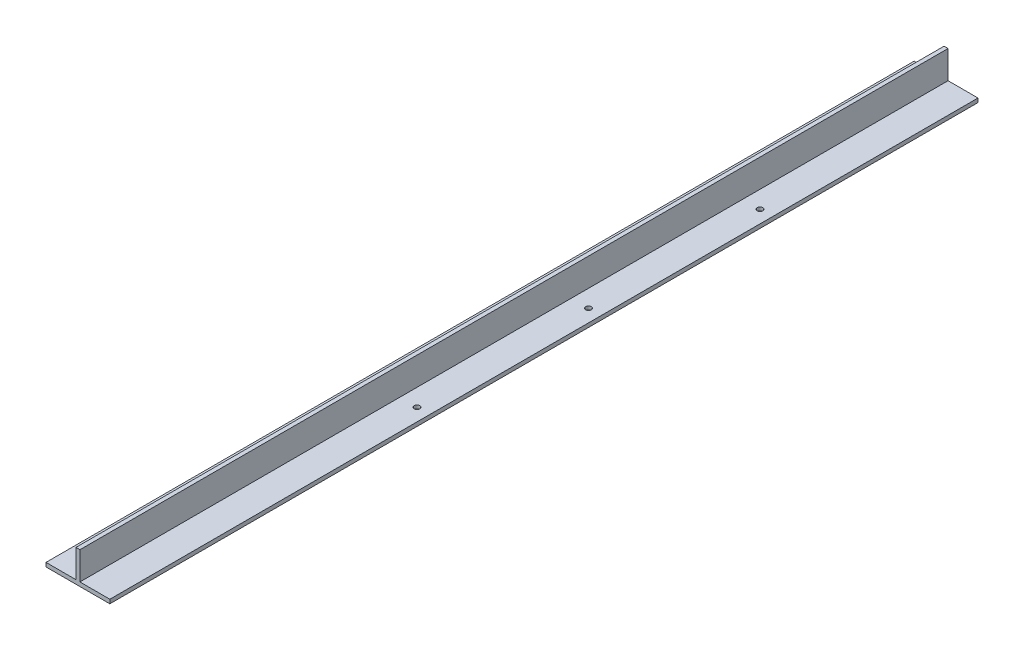
ISO-10303-21;
HEADER;
FILE_DESCRIPTION(('STEP AP214'),'2;1');
FILE_NAME('part.step','',(''),(''),'','','');
FILE_SCHEMA(('AUTOMOTIVE_DESIGN { 1 0 10303 214 1 1 1 1 }'));
ENDSEC;
DATA;
#1=APPLICATION_CONTEXT('core data for automotive mechanical design processes');
#2=APPLICATION_PROTOCOL_DEFINITION('international standard','automotive_design',2000,#1);
#3=PRODUCT_CONTEXT('',#1,'mechanical');
#4=PRODUCT('Part','Part','',(#3));
#5=PRODUCT_RELATED_PRODUCT_CATEGORY('part','',(#4));
#6=PRODUCT_DEFINITION_FORMATION('','',#4);
#7=PRODUCT_DEFINITION_CONTEXT('part definition',#1,'design');
#8=PRODUCT_DEFINITION('design','',#6,#7);
#9=PRODUCT_DEFINITION_SHAPE('','',#8);
#10=(LENGTH_UNIT() NAMED_UNIT(*) SI_UNIT(.MILLI.,.METRE.));
#11=(NAMED_UNIT(*) PLANE_ANGLE_UNIT() SI_UNIT($,.RADIAN.));
#12=(NAMED_UNIT(*) SI_UNIT($,.STERADIAN.) SOLID_ANGLE_UNIT());
#13=UNCERTAINTY_MEASURE_WITH_UNIT(LENGTH_MEASURE(1.E-05),#10,'distance_accuracy_value','');
#14=(GEOMETRIC_REPRESENTATION_CONTEXT(3) GLOBAL_UNCERTAINTY_ASSIGNED_CONTEXT((#13)) GLOBAL_UNIT_ASSIGNED_CONTEXT((#10,
#11,#12)) REPRESENTATION_CONTEXT('',''));
#15=CARTESIAN_POINT('',(0.,0.,0.));
#16=DIRECTION('',(0.,0.,1.));
#17=DIRECTION('',(1.,0.,0.));
#18=AXIS2_PLACEMENT_3D('',#15,#16,#17);
#19=CARTESIAN_POINT('',(-150.489347611488,-310.689072168843,-406.95));
#20=DIRECTION('',(0.,-1.,0.));
#21=DIRECTION('',(0.,0.,-1.));
#22=AXIS2_PLACEMENT_3D('',#19,#20,#21);
#23=CYLINDRICAL_SURFACE('',#22,3.4);
#24=CARTESIAN_POINT('',(-150.489347611488,-310.017902480922,-406.95));
#25=DIRECTION('',(0.,-1.,0.));
#26=DIRECTION('',(1.,0.,0.));
#27=AXIS2_PLACEMENT_3D('',#24,#25,#26);
#28=CIRCLE('',#27,3.39999999994731);
#29=CARTESIAN_POINT('',(-147.089347611541,-310.017902480922,-406.95));
#30=VERTEX_POINT('',#29);
#31=EDGE_CURVE('E148',#30,#30,#28,.T.);
#32=ORIENTED_EDGE('',*,*,#31,.T.);
#33=EDGE_LOOP('',(#32));
#34=FACE_BOUND('',#33,.T.);
#35=CARTESIAN_POINT('',(-150.489347611488,-305.926572168843,-406.95));
#36=DIRECTION('',(0.,-1.,0.));
#37=DIRECTION('',(0.,0.,-1.));
#38=AXIS2_PLACEMENT_3D('',#35,#36,#37);
#39=CIRCLE('',#38,3.4);
#40=CARTESIAN_POINT('',(-150.489347611488,-305.926572168843,-410.35));
#41=VERTEX_POINT('',#40);
#42=EDGE_CURVE('E20',#41,#41,#39,.T.);
#43=ORIENTED_EDGE('',*,*,#42,.F.);
#44=EDGE_LOOP('',(#43));
#45=FACE_BOUND('',#44,.T.);
#46=ADVANCED_FACE('F17',(#34,#45),#23,.F.);
#47=CARTESIAN_POINT('',(-196.489347611488,-310.689072168843,139.05));
#48=DIRECTION('',(0.,-1.,0.));
#49=DIRECTION('',(0.,0.,-1.));
#50=AXIS2_PLACEMENT_3D('',#47,#48,#49);
#51=CYLINDRICAL_SURFACE('',#50,3.4);
#52=CARTESIAN_POINT('',(-196.489347611488,-305.926572168843,139.05));
#53=DIRECTION('',(0.,-1.,0.));
#54=DIRECTION('',(0.,0.,-1.));
#55=AXIS2_PLACEMENT_3D('',#52,#53,#54);
#56=CIRCLE('',#55,3.4);
#57=CARTESIAN_POINT('',(-196.489347611488,-305.926572168843,135.65));
#58=VERTEX_POINT('',#57);
#59=EDGE_CURVE('E122',#58,#58,#56,.T.);
#60=ORIENTED_EDGE('',*,*,#59,.F.);
#61=EDGE_LOOP('',(#60));
#62=FACE_BOUND('',#61,.T.);
#63=CARTESIAN_POINT('',(-196.489347611488,-310.017902480979,139.05));
#64=DIRECTION('',(0.,-1.,0.));
#65=DIRECTION('',(1.,0.,0.));
#66=AXIS2_PLACEMENT_3D('',#63,#64,#65);
#67=CIRCLE('',#66,3.40000000001189);
#68=CARTESIAN_POINT('',(-193.089347611476,-310.017902480979,139.05));
#69=VERTEX_POINT('',#68);
#70=EDGE_CURVE('E144',#69,#69,#67,.T.);
#71=ORIENTED_EDGE('',*,*,#70,.T.);
#72=EDGE_LOOP('',(#71));
#73=FACE_BOUND('',#72,.T.);
#74=ADVANCED_FACE('F202',(#62,#73),#51,.F.);
#75=CARTESIAN_POINT('',(-150.489347611488,-310.689072168843,-202.2598));
#76=DIRECTION('',(0.,-1.,0.));
#77=DIRECTION('',(0.,0.,-1.));
#78=AXIS2_PLACEMENT_3D('',#75,#76,#77);
#79=CYLINDRICAL_SURFACE('',#78,3.4);
#80=CARTESIAN_POINT('',(-150.489347611488,-310.017902480922,-202.2598));
#81=DIRECTION('',(0.,-1.,0.));
#82=DIRECTION('',(1.,0.,0.));
#83=AXIS2_PLACEMENT_3D('',#80,#81,#82);
#84=CIRCLE('',#83,3.39999999994731);
#85=CARTESIAN_POINT('',(-147.089347611541,-310.017902480922,-202.2598));
#86=VERTEX_POINT('',#85);
#87=EDGE_CURVE('E140',#86,#86,#84,.T.);
#88=ORIENTED_EDGE('',*,*,#87,.T.);
#89=EDGE_LOOP('',(#88));
#90=FACE_BOUND('',#89,.T.);
#91=CARTESIAN_POINT('',(-150.489347611488,-305.926572168843,-202.2598));
#92=DIRECTION('',(0.,-1.,0.));
#93=DIRECTION('',(0.,0.,-1.));
#94=AXIS2_PLACEMENT_3D('',#91,#92,#93);
#95=CIRCLE('',#94,3.4);
#96=CARTESIAN_POINT('',(-150.489347611488,-305.926572168843,-205.6598));
#97=VERTEX_POINT('',#96);
#98=EDGE_CURVE('E190',#97,#97,#95,.T.);
#99=ORIENTED_EDGE('',*,*,#98,.F.);
#100=EDGE_LOOP('',(#99));
#101=FACE_BOUND('',#100,.T.);
#102=ADVANCED_FACE('F207',(#90,#101),#79,.F.);
#103=CARTESIAN_POINT('',(-196.489347611488,-310.689072168843,-270.3304));
#104=DIRECTION('',(0.,-1.,0.));
#105=DIRECTION('',(0.,0.,-1.));
#106=AXIS2_PLACEMENT_3D('',#103,#104,#105);
#107=CYLINDRICAL_SURFACE('',#106,3.4);
#108=CARTESIAN_POINT('',(-196.489347611488,-305.926572168843,-270.3304));
#109=DIRECTION('',(0.,-1.,0.));
#110=DIRECTION('',(0.,0.,-1.));
#111=AXIS2_PLACEMENT_3D('',#108,#109,#110);
#112=CIRCLE('',#111,3.4);
#113=CARTESIAN_POINT('',(-196.489347611488,-305.926572168843,-273.7304));
#114=VERTEX_POINT('',#113);
#115=EDGE_CURVE('E151',#114,#114,#112,.T.);
#116=ORIENTED_EDGE('',*,*,#115,.F.);
#117=EDGE_LOOP('',(#116));
#118=FACE_BOUND('',#117,.T.);
#119=CARTESIAN_POINT('',(-196.489347611488,-310.017902480922,-270.3304));
#120=DIRECTION('',(0.,-1.,0.));
#121=DIRECTION('',(1.,0.,0.));
#122=AXIS2_PLACEMENT_3D('',#119,#120,#121);
#123=CIRCLE('',#122,3.40000000001189);
#124=CARTESIAN_POINT('',(-193.089347611476,-310.017902480922,-270.3304));
#125=VERTEX_POINT('',#124);
#126=EDGE_CURVE('E136',#125,#125,#123,.T.);
#127=ORIENTED_EDGE('',*,*,#126,.T.);
#128=EDGE_LOOP('',(#127));
#129=FACE_BOUND('',#128,.T.);
#130=ADVANCED_FACE('F278',(#118,#129),#107,.F.);
#131=CARTESIAN_POINT('',(-150.489347611488,-310.689072168843,2.43040000000019));
#132=DIRECTION('',(0.,-1.,0.));
#133=DIRECTION('',(0.,0.,-1.));
#134=AXIS2_PLACEMENT_3D('',#131,#132,#133);
#135=CYLINDRICAL_SURFACE('',#134,3.4);
#136=CARTESIAN_POINT('',(-150.489347611488,-310.017902480922,2.43040000000019));
#137=DIRECTION('',(0.,-1.,0.));
#138=DIRECTION('',(1.,0.,0.));
#139=AXIS2_PLACEMENT_3D('',#136,#137,#138);
#140=CIRCLE('',#139,3.39999999994731);
#141=CARTESIAN_POINT('',(-147.089347611541,-310.017902480922,2.43040000000019));
#142=VERTEX_POINT('',#141);
#143=EDGE_CURVE('E132',#142,#142,#140,.T.);
#144=ORIENTED_EDGE('',*,*,#143,.T.);
#145=EDGE_LOOP('',(#144));
#146=FACE_BOUND('',#145,.T.);
#147=CARTESIAN_POINT('',(-150.489347611488,-305.926572168843,2.43040000000019));
#148=DIRECTION('',(0.,-1.,0.));
#149=DIRECTION('',(0.,0.,-1.));
#150=AXIS2_PLACEMENT_3D('',#147,#148,#149);
#151=CIRCLE('',#150,3.4);
#152=CARTESIAN_POINT('',(-150.489347611488,-305.926572168843,-0.96959999999981));
#153=VERTEX_POINT('',#152);
#154=EDGE_CURVE('E102',#153,#153,#151,.T.);
#155=ORIENTED_EDGE('',*,*,#154,.F.);
#156=EDGE_LOOP('',(#155));
#157=FACE_BOUND('',#156,.T.);
#158=ADVANCED_FACE('F274',(#146,#157),#135,.F.);
#159=CARTESIAN_POINT('',(-196.489347611488,-310.689072168843,-65.6402000000003));
#160=DIRECTION('',(0.,-1.,0.));
#161=DIRECTION('',(0.,0.,-1.));
#162=AXIS2_PLACEMENT_3D('',#159,#160,#161);
#163=CYLINDRICAL_SURFACE('',#162,3.4);
#164=CARTESIAN_POINT('',(-196.489347611488,-305.926572168843,-65.6402000000003));
#165=DIRECTION('',(0.,-1.,0.));
#166=DIRECTION('',(0.,0.,-1.));
#167=AXIS2_PLACEMENT_3D('',#164,#165,#166);
#168=CIRCLE('',#167,3.4);
#169=CARTESIAN_POINT('',(-196.489347611488,-305.926572168843,-69.0402000000003));
#170=VERTEX_POINT('',#169);
#171=EDGE_CURVE('E181',#170,#170,#168,.T.);
#172=ORIENTED_EDGE('',*,*,#171,.F.);
#173=EDGE_LOOP('',(#172));
#174=FACE_BOUND('',#173,.T.);
#175=CARTESIAN_POINT('',(-196.489347611488,-310.017902480865,-65.6402000000003));
#176=DIRECTION('',(0.,-1.,0.));
#177=DIRECTION('',(1.,0.,0.));
#178=AXIS2_PLACEMENT_3D('',#175,#176,#177);
#179=CIRCLE('',#178,3.40000000001189);
#180=CARTESIAN_POINT('',(-193.089347611476,-310.017902480865,-65.6402000000003));
#181=VERTEX_POINT('',#180);
#182=EDGE_CURVE('E94',#181,#181,#179,.T.);
#183=ORIENTED_EDGE('',*,*,#182,.T.);
#184=EDGE_LOOP('',(#183));
#185=FACE_BOUND('',#184,.T.);
#186=ADVANCED_FACE('F270',(#174,#185),#163,.F.);
#187=CARTESIAN_POINT('',(-171.108097611488,-305.926572168843,-652.05));
#188=DIRECTION('',(0.,1.,0.));
#189=DIRECTION('',(0.,0.,1.));
#190=AXIS2_PLACEMENT_3D('',#187,#188,#189);
#191=PLANE('',#190);
#192=ORIENTED_EDGE('',*,*,#154,.T.);
#193=EDGE_LOOP('',(#192));
#194=FACE_BOUND('',#193,.T.);
#195=ORIENTED_EDGE('',*,*,#98,.T.);
#196=EDGE_LOOP('',(#195));
#197=FACE_BOUND('',#196,.T.);
#198=ORIENTED_EDGE('',*,*,#42,.T.);
#199=EDGE_LOOP('',(#198));
#200=FACE_BOUND('',#199,.T.);
#201=DIRECTION('',(1.,0.,0.));
#202=VECTOR('',#201,1.);
#203=CARTESIAN_POINT('',(-898.489347611488,-305.926572168843,384.15));
#204=LINE('',#203,#202);
#205=CARTESIAN_POINT('',(-135.389347611488,-305.926572168843,384.15));
#206=VERTEX_POINT('',#205);
#207=CARTESIAN_POINT('',(-171.108097611488,-305.926572168843,384.15));
#208=VERTEX_POINT('',#207);
#209=EDGE_CURVE('E528',#206,#208,#204,.F.);
#210=ORIENTED_EDGE('',*,*,#209,.F.);
#211=DIRECTION('',(0.,0.,1.));
#212=VECTOR('',#211,1.);
#213=CARTESIAN_POINT('',(-135.389347611488,-305.926572168843,-652.05));
#214=LINE('',#213,#212);
#215=CARTESIAN_POINT('',(-135.389347611488,-305.926572168843,-652.05));
#216=VERTEX_POINT('',#215);
#217=EDGE_CURVE('E90',#216,#206,#214,.T.);
#218=ORIENTED_EDGE('',*,*,#217,.F.);
#219=DIRECTION('',(1.,0.,0.));
#220=VECTOR('',#219,1.);
#221=CARTESIAN_POINT('',(-173.489347611488,-305.926572168843,-652.05));
#222=LINE('',#221,#220);
#223=CARTESIAN_POINT('',(-171.108097611488,-305.926572168843,-652.05));
#224=VERTEX_POINT('',#223);
#225=EDGE_CURVE('E85',#216,#224,#222,.F.);
#226=ORIENTED_EDGE('',*,*,#225,.T.);
#227=DIRECTION('',(0.,0.,1.));
#228=VECTOR('',#227,1.);
#229=CARTESIAN_POINT('',(-171.108097611488,-305.926572168843,-652.05));
#230=LINE('',#229,#228);
#231=EDGE_CURVE('E88',#208,#224,#230,.F.);
#232=ORIENTED_EDGE('',*,*,#231,.F.);
#233=EDGE_LOOP('',(#210,#218,#226,#232));
#234=FACE_BOUND('',#233,.T.);
#235=ADVANCED_FACE('F87',(#194,#197,#200,#234),#191,.T.);
#236=CARTESIAN_POINT('',(-171.108097611488,-272.589072168843,-652.05));
#237=DIRECTION('',(1.,0.,0.));
#238=DIRECTION('',(0.,1.,0.));
#239=AXIS2_PLACEMENT_3D('',#236,#237,#238);
#240=PLANE('',#239);
#241=DIRECTION('',(0.,1.,0.));
#242=VECTOR('',#241,1.);
#243=CARTESIAN_POINT('',(-171.108097611488,-310.689072168843,384.15));
#244=LINE('',#243,#242);
#245=CARTESIAN_POINT('',(-171.108097611488,-272.589072168843,384.15));
#246=VERTEX_POINT('',#245);
#247=EDGE_CURVE('E98',#208,#246,#244,.T.);
#248=ORIENTED_EDGE('',*,*,#247,.F.);
#249=ORIENTED_EDGE('',*,*,#231,.T.);
#250=DIRECTION('',(0.,1.,0.));
#251=VECTOR('',#250,1.);
#252=CARTESIAN_POINT('',(-171.108097611488,-291.639072168843,-652.05));
#253=LINE('',#252,#251);
#254=CARTESIAN_POINT('',(-171.108097611488,-272.589072168843,-652.05));
#255=VERTEX_POINT('',#254);
#256=EDGE_CURVE('E80',#224,#255,#253,.T.);
#257=ORIENTED_EDGE('',*,*,#256,.T.);
#258=DIRECTION('',(0.,0.,1.));
#259=VECTOR('',#258,1.);
#260=CARTESIAN_POINT('',(-171.108097611488,-272.589072168843,-652.05));
#261=LINE('',#260,#259);
#262=EDGE_CURVE('E101',#246,#255,#261,.F.);
#263=ORIENTED_EDGE('',*,*,#262,.F.);
#264=EDGE_LOOP('',(#248,#249,#257,#263));
#265=FACE_BOUND('',#264,.T.);
#266=ADVANCED_FACE('F96',(#265),#240,.T.);
#267=CARTESIAN_POINT('',(-175.870597611488,-272.589072168843,-652.05));
#268=DIRECTION('',(0.,1.,0.));
#269=DIRECTION('',(0.,0.,1.));
#270=AXIS2_PLACEMENT_3D('',#267,#268,#269);
#271=PLANE('',#270);
#272=DIRECTION('',(1.,0.,0.));
#273=VECTOR('',#272,1.);
#274=CARTESIAN_POINT('',(-898.489347611488,-272.589072168843,384.15));
#275=LINE('',#274,#273);
#276=CARTESIAN_POINT('',(-175.870597611488,-272.589072168843,384.15));
#277=VERTEX_POINT('',#276);
#278=EDGE_CURVE('E519',#246,#277,#275,.F.);
#279=ORIENTED_EDGE('',*,*,#278,.F.);
#280=ORIENTED_EDGE('',*,*,#262,.T.);
#281=DIRECTION('',(1.,0.,0.));
#282=VECTOR('',#281,1.);
#283=CARTESIAN_POINT('',(-173.489347611488,-272.589072168843,-652.05));
#284=LINE('',#283,#282);
#285=CARTESIAN_POINT('',(-175.870597611488,-272.589072168843,-652.05));
#286=VERTEX_POINT('',#285);
#287=EDGE_CURVE('E108',#255,#286,#284,.F.);
#288=ORIENTED_EDGE('',*,*,#287,.T.);
#289=DIRECTION('',(0.,0.,1.));
#290=VECTOR('',#289,1.);
#291=CARTESIAN_POINT('',(-175.870597611488,-272.589072168843,-652.05));
#292=LINE('',#291,#290);
#293=EDGE_CURVE('E123',#277,#286,#292,.F.);
#294=ORIENTED_EDGE('',*,*,#293,.F.);
#295=EDGE_LOOP('',(#279,#280,#288,#294));
#296=FACE_BOUND('',#295,.T.);
#297=ADVANCED_FACE('F261',(#296),#271,.T.);
#298=CARTESIAN_POINT('',(-175.870597611488,-305.926572168843,-652.05));
#299=DIRECTION('',(-1.,0.,0.));
#300=DIRECTION('',(0.,-1.,0.));
#301=AXIS2_PLACEMENT_3D('',#298,#299,#300);
#302=PLANE('',#301);
#303=DIRECTION('',(0.,1.,0.));
#304=VECTOR('',#303,1.);
#305=CARTESIAN_POINT('',(-175.870597611488,-310.689072168843,384.15));
#306=LINE('',#305,#304);
#307=CARTESIAN_POINT('',(-175.870597611488,-305.926572168843,384.15));
#308=VERTEX_POINT('',#307);
#309=EDGE_CURVE('E514',#277,#308,#306,.F.);
#310=ORIENTED_EDGE('',*,*,#309,.F.);
#311=ORIENTED_EDGE('',*,*,#293,.T.);
#312=DIRECTION('',(0.,1.,0.));
#313=VECTOR('',#312,1.);
#314=CARTESIAN_POINT('',(-175.870597611488,-291.639072168843,-652.05));
#315=LINE('',#314,#313);
#316=CARTESIAN_POINT('',(-175.870597611488,-305.926572168843,-652.05));
#317=VERTEX_POINT('',#316);
#318=EDGE_CURVE('E115',#286,#317,#315,.F.);
#319=ORIENTED_EDGE('',*,*,#318,.T.);
#320=DIRECTION('',(0.,0.,1.));
#321=VECTOR('',#320,1.);
#322=CARTESIAN_POINT('',(-175.870597611488,-305.926572168843,-652.05));
#323=LINE('',#322,#321);
#324=EDGE_CURVE('E119',#308,#317,#323,.F.);
#325=ORIENTED_EDGE('',*,*,#324,.F.);
#326=EDGE_LOOP('',(#310,#311,#319,#325));
#327=FACE_BOUND('',#326,.T.);
#328=ADVANCED_FACE('F257',(#327),#302,.T.);
#329=CARTESIAN_POINT('',(-211.589347611488,-305.926572168843,-652.05));
#330=DIRECTION('',(0.,1.,0.));
#331=DIRECTION('',(0.,0.,1.));
#332=AXIS2_PLACEMENT_3D('',#329,#330,#331);
#333=PLANE('',#332);
#334=ORIENTED_EDGE('',*,*,#115,.T.);
#335=EDGE_LOOP('',(#334));
#336=FACE_BOUND('',#335,.T.);
#337=ORIENTED_EDGE('',*,*,#171,.T.);
#338=EDGE_LOOP('',(#337));
#339=FACE_BOUND('',#338,.T.);
#340=ORIENTED_EDGE('',*,*,#59,.T.);
#341=EDGE_LOOP('',(#340));
#342=FACE_BOUND('',#341,.T.);
#343=DIRECTION('',(1.,0.,0.));
#344=VECTOR('',#343,1.);
#345=CARTESIAN_POINT('',(-898.489347611488,-305.926572168843,384.15));
#346=LINE('',#345,#344);
#347=CARTESIAN_POINT('',(-211.589347611488,-305.926572168843,384.15));
#348=VERTEX_POINT('',#347);
#349=EDGE_CURVE('E509',#308,#348,#346,.F.);
#350=ORIENTED_EDGE('',*,*,#349,.F.);
#351=ORIENTED_EDGE('',*,*,#324,.T.);
#352=DIRECTION('',(1.,0.,0.));
#353=VECTOR('',#352,1.);
#354=CARTESIAN_POINT('',(-173.489347611488,-305.926572168843,-652.05));
#355=LINE('',#354,#353);
#356=CARTESIAN_POINT('',(-211.589347611488,-305.926572168843,-652.05));
#357=VERTEX_POINT('',#356);
#358=EDGE_CURVE('E540',#317,#357,#355,.F.);
#359=ORIENTED_EDGE('',*,*,#358,.T.);
#360=DIRECTION('',(0.,0.,1.));
#361=VECTOR('',#360,1.);
#362=CARTESIAN_POINT('',(-211.589347611488,-305.926572168843,-652.05));
#363=LINE('',#362,#361);
#364=EDGE_CURVE('E177',#348,#357,#363,.F.);
#365=ORIENTED_EDGE('',*,*,#364,.F.);
#366=EDGE_LOOP('',(#350,#351,#359,#365));
#367=FACE_BOUND('',#366,.T.);
#368=ADVANCED_FACE('F253',(#336,#339,#342,#367),#333,.T.);
#369=CARTESIAN_POINT('',(-150.489347611488,-310.689072168827,-406.95));
#370=DIRECTION('',(0.,-1.,0.));
#371=DIRECTION('',(0.,0.,-1.));
#372=AXIS2_PLACEMENT_3D('',#369,#370,#371);
#373=CONICAL_SURFACE('',#372,4.56249999991129,1.04719755120679);
#374=CARTESIAN_POINT('',(-150.489347611488,-310.68907216889,-406.95));
#375=DIRECTION('',(0.,-1.,0.));
#376=DIRECTION('',(0.,0.,-1.));
#377=AXIS2_PLACEMENT_3D('',#374,#375,#376);
#378=CIRCLE('',#377,4.56250000002001);
#379=CARTESIAN_POINT('',(-150.489347611488,-310.68907216889,-411.51250000002));
#380=VERTEX_POINT('',#379);
#381=EDGE_CURVE('E173',#380,#380,#378,.F.);
#382=ORIENTED_EDGE('',*,*,#381,.F.);
#383=EDGE_LOOP('',(#382));
#384=FACE_BOUND('',#383,.T.);
#385=ORIENTED_EDGE('',*,*,#31,.F.);
#386=EDGE_LOOP('',(#385));
#387=FACE_BOUND('',#386,.T.);
#388=ADVANCED_FACE('F249',(#384,#387),#373,.F.);
#389=CARTESIAN_POINT('',(-196.489347611488,-310.689072168884,139.05));
#390=DIRECTION('',(0.,-1.,0.));
#391=DIRECTION('',(0.,0.,-1.));
#392=AXIS2_PLACEMENT_3D('',#389,#390,#391);
#393=CONICAL_SURFACE('',#392,4.56249999997588,1.04719755120111);
#394=CARTESIAN_POINT('',(-196.489347611488,-310.689072168884,139.05));
#395=DIRECTION('',(0.,-1.,0.));
#396=DIRECTION('',(0.,0.,-1.));
#397=AXIS2_PLACEMENT_3D('',#394,#395,#396);
#398=CIRCLE('',#397,4.56249999997588);
#399=CARTESIAN_POINT('',(-196.489347611488,-310.689072168884,134.487500000024));
#400=VERTEX_POINT('',#399);
#401=EDGE_CURVE('E169',#400,#400,#398,.F.);
#402=ORIENTED_EDGE('',*,*,#401,.F.);
#403=EDGE_LOOP('',(#402));
#404=FACE_BOUND('',#403,.T.);
#405=ORIENTED_EDGE('',*,*,#70,.F.);
#406=EDGE_LOOP('',(#405));
#407=FACE_BOUND('',#406,.T.);
#408=ADVANCED_FACE('F245',(#404,#407),#393,.F.);
#409=CARTESIAN_POINT('',(-150.489347611488,-310.689072168827,-202.2598));
#410=DIRECTION('',(0.,-1.,0.));
#411=DIRECTION('',(0.,0.,-1.));
#412=AXIS2_PLACEMENT_3D('',#409,#410,#411);
#413=CONICAL_SURFACE('',#412,4.56249999991129,1.04719755120679);
#414=CARTESIAN_POINT('',(-150.489347611488,-310.68907216889,-202.2598));
#415=DIRECTION('',(0.,-1.,0.));
#416=DIRECTION('',(0.,0.,-1.));
#417=AXIS2_PLACEMENT_3D('',#414,#415,#416);
#418=CIRCLE('',#417,4.56250000002001);
#419=CARTESIAN_POINT('',(-150.489347611488,-310.68907216889,-206.82230000002));
#420=VERTEX_POINT('',#419);
#421=EDGE_CURVE('E165',#420,#420,#418,.F.);
#422=ORIENTED_EDGE('',*,*,#421,.F.);
#423=EDGE_LOOP('',(#422));
#424=FACE_BOUND('',#423,.T.);
#425=ORIENTED_EDGE('',*,*,#87,.F.);
#426=EDGE_LOOP('',(#425));
#427=FACE_BOUND('',#426,.T.);
#428=ADVANCED_FACE('F241',(#424,#427),#413,.F.);
#429=CARTESIAN_POINT('',(-196.489347611488,-310.689072168827,-270.3304));
#430=DIRECTION('',(0.,-1.,0.));
#431=DIRECTION('',(0.,0.,-1.));
#432=AXIS2_PLACEMENT_3D('',#429,#430,#431);
#433=CONICAL_SURFACE('',#432,4.56249999997588,1.04719755120111);
#434=CARTESIAN_POINT('',(-196.489347611488,-310.689072168827,-270.3304));
#435=DIRECTION('',(0.,-1.,0.));
#436=DIRECTION('',(0.,0.,-1.));
#437=AXIS2_PLACEMENT_3D('',#434,#435,#436);
#438=CIRCLE('',#437,4.56249999997588);
#439=CARTESIAN_POINT('',(-196.489347611488,-310.689072168827,-274.892899999976));
#440=VERTEX_POINT('',#439);
#441=EDGE_CURVE('E161',#440,#440,#438,.F.);
#442=ORIENTED_EDGE('',*,*,#441,.F.);
#443=EDGE_LOOP('',(#442));
#444=FACE_BOUND('',#443,.T.);
#445=ORIENTED_EDGE('',*,*,#126,.F.);
#446=EDGE_LOOP('',(#445));
#447=FACE_BOUND('',#446,.T.);
#448=ADVANCED_FACE('F237',(#444,#447),#433,.F.);
#449=CARTESIAN_POINT('',(-150.489347611488,-310.689072168827,2.43040000000019));
#450=DIRECTION('',(0.,-1.,0.));
#451=DIRECTION('',(0.,0.,-1.));
#452=AXIS2_PLACEMENT_3D('',#449,#450,#451);
#453=CONICAL_SURFACE('',#452,4.56249999991129,1.04719755120679);
#454=CARTESIAN_POINT('',(-150.489347611488,-310.68907216889,2.43040000000019));
#455=DIRECTION('',(0.,-1.,0.));
#456=DIRECTION('',(0.,0.,-1.));
#457=AXIS2_PLACEMENT_3D('',#454,#455,#456);
#458=CIRCLE('',#457,4.56250000002001);
#459=CARTESIAN_POINT('',(-150.489347611488,-310.68907216889,-2.13210000001982));
#460=VERTEX_POINT('',#459);
#461=EDGE_CURVE('E157',#460,#460,#458,.F.);
#462=ORIENTED_EDGE('',*,*,#461,.F.);
#463=EDGE_LOOP('',(#462));
#464=FACE_BOUND('',#463,.T.);
#465=ORIENTED_EDGE('',*,*,#143,.F.);
#466=EDGE_LOOP('',(#465));
#467=FACE_BOUND('',#466,.T.);
#468=ADVANCED_FACE('F233',(#464,#467),#453,.F.);
#469=CARTESIAN_POINT('',(-196.489347611488,-310.689072168884,-65.6402000000003));
#470=DIRECTION('',(0.,-1.,0.));
#471=DIRECTION('',(0.,0.,-1.));
#472=AXIS2_PLACEMENT_3D('',#469,#470,#471);
#473=CONICAL_SURFACE('',#472,4.56250000014641,1.04719755120679);
#474=CARTESIAN_POINT('',(-196.489347611488,-310.689072168819,-65.6402000000003));
#475=DIRECTION('',(0.,-1.,0.));
#476=DIRECTION('',(0.,0.,-1.));
#477=AXIS2_PLACEMENT_3D('',#474,#475,#476);
#478=CIRCLE('',#477,4.56250000003272);
#479=CARTESIAN_POINT('',(-196.489347611488,-310.689072168819,-70.202700000033));
#480=VERTEX_POINT('',#479);
#481=EDGE_CURVE('E152',#480,#480,#478,.F.);
#482=ORIENTED_EDGE('',*,*,#481,.F.);
#483=EDGE_LOOP('',(#482));
#484=FACE_BOUND('',#483,.T.);
#485=ORIENTED_EDGE('',*,*,#182,.F.);
#486=EDGE_LOOP('',(#485));
#487=FACE_BOUND('',#486,.T.);
#488=ADVANCED_FACE('F230',(#484,#487),#473,.F.);
#489=CARTESIAN_POINT('',(-173.489347611488,-291.639072168843,-652.05));
#490=DIRECTION('',(0.,0.,1.));
#491=DIRECTION('',(1.,0.,0.));
#492=AXIS2_PLACEMENT_3D('',#489,#490,#491);
#493=PLANE('',#492);
#494=ORIENTED_EDGE('',*,*,#358,.F.);
#495=ORIENTED_EDGE('',*,*,#318,.F.);
#496=ORIENTED_EDGE('',*,*,#287,.F.);
#497=ORIENTED_EDGE('',*,*,#256,.F.);
#498=ORIENTED_EDGE('',*,*,#225,.F.);
#499=DIRECTION('',(0.,1.,0.));
#500=VECTOR('',#499,1.);
#501=CARTESIAN_POINT('',(-135.389347611488,-305.926572168843,-652.05));
#502=LINE('',#501,#500);
#503=CARTESIAN_POINT('',(-135.389347611488,-310.689072168843,-652.05));
#504=VERTEX_POINT('',#503);
#505=EDGE_CURVE('E537',#504,#216,#502,.T.);
#506=ORIENTED_EDGE('',*,*,#505,.F.);
#507=DIRECTION('',(1.,0.,0.));
#508=VECTOR('',#507,1.);
#509=CARTESIAN_POINT('',(-135.389347611488,-310.689072168843,-652.05));
#510=LINE('',#509,#508);
#511=CARTESIAN_POINT('',(-211.589347611488,-310.689072168843,-652.05));
#512=VERTEX_POINT('',#511);
#513=EDGE_CURVE('E156',#512,#504,#510,.T.);
#514=ORIENTED_EDGE('',*,*,#513,.F.);
#515=DIRECTION('',(0.,-1.,0.));
#516=VECTOR('',#515,1.);
#517=CARTESIAN_POINT('',(-211.589347611488,-310.689072168843,-652.05));
#518=LINE('',#517,#516);
#519=EDGE_CURVE('E513',#357,#512,#518,.T.);
#520=ORIENTED_EDGE('',*,*,#519,.F.);
#521=EDGE_LOOP('',(#494,#495,#496,#497,#498,#506,#514,#520));
#522=FACE_BOUND('',#521,.T.);
#523=ADVANCED_FACE('F106',(#522),#493,.F.);
#524=CARTESIAN_POINT('',(-135.389347611488,-305.926572168843,-652.05));
#525=DIRECTION('',(1.,0.,0.));
#526=DIRECTION('',(0.,1.,0.));
#527=AXIS2_PLACEMENT_3D('',#524,#525,#526);
#528=PLANE('',#527);
#529=DIRECTION('',(0.,1.,0.));
#530=VECTOR('',#529,1.);
#531=CARTESIAN_POINT('',(-135.389347611488,-310.689072168843,384.15));
#532=LINE('',#531,#530);
#533=CARTESIAN_POINT('',(-135.389347611488,-310.689072168843,384.15));
#534=VERTEX_POINT('',#533);
#535=EDGE_CURVE('E531',#534,#206,#532,.T.);
#536=ORIENTED_EDGE('',*,*,#535,.F.);
#537=DIRECTION('',(0.,0.,-1.));
#538=VECTOR('',#537,1.);
#539=CARTESIAN_POINT('',(-135.389347611488,-310.689072168843,-652.05));
#540=LINE('',#539,#538);
#541=EDGE_CURVE('E554',#504,#534,#540,.F.);
#542=ORIENTED_EDGE('',*,*,#541,.F.);
#543=ORIENTED_EDGE('',*,*,#505,.T.);
#544=ORIENTED_EDGE('',*,*,#217,.T.);
#545=EDGE_LOOP('',(#536,#542,#543,#544));
#546=FACE_BOUND('',#545,.T.);
#547=ADVANCED_FACE('F224',(#546),#528,.T.);
#548=CARTESIAN_POINT('',(-898.489347611488,-310.689072168843,384.15));
#549=DIRECTION('',(0.,0.,1.));
#550=DIRECTION('',(1.,0.,0.));
#551=AXIS2_PLACEMENT_3D('',#548,#549,#550);
#552=PLANE('',#551);
#553=ORIENTED_EDGE('',*,*,#349,.T.);
#554=DIRECTION('',(0.,-1.,0.));
#555=VECTOR('',#554,1.);
#556=CARTESIAN_POINT('',(-211.589347611488,-310.689072168843,384.15));
#557=LINE('',#556,#555);
#558=CARTESIAN_POINT('',(-211.589347611488,-310.689072168843,384.15));
#559=VERTEX_POINT('',#558);
#560=EDGE_CURVE('E36',#559,#348,#557,.F.);
#561=ORIENTED_EDGE('',*,*,#560,.F.);
#562=DIRECTION('',(1.,0.,0.));
#563=VECTOR('',#562,1.);
#564=CARTESIAN_POINT('',(-135.389347611488,-310.689072168843,384.15));
#565=LINE('',#564,#563);
#566=EDGE_CURVE('E27',#534,#559,#565,.F.);
#567=ORIENTED_EDGE('',*,*,#566,.F.);
#568=ORIENTED_EDGE('',*,*,#535,.T.);
#569=ORIENTED_EDGE('',*,*,#209,.T.);
#570=ORIENTED_EDGE('',*,*,#247,.T.);
#571=ORIENTED_EDGE('',*,*,#278,.T.);
#572=ORIENTED_EDGE('',*,*,#309,.T.);
#573=EDGE_LOOP('',(#553,#561,#567,#568,#569,#570,#571,#572));
#574=FACE_BOUND('',#573,.T.);
#575=ADVANCED_FACE('F216',(#574),#552,.T.);
#576=CARTESIAN_POINT('',(-211.589347611488,-310.689072168843,-652.05));
#577=DIRECTION('',(-1.,0.,0.));
#578=DIRECTION('',(0.,-1.,0.));
#579=AXIS2_PLACEMENT_3D('',#576,#577,#578);
#580=PLANE('',#579);
#581=ORIENTED_EDGE('',*,*,#560,.T.);
#582=ORIENTED_EDGE('',*,*,#364,.T.);
#583=ORIENTED_EDGE('',*,*,#519,.T.);
#584=DIRECTION('',(0.,0.,-1.));
#585=VECTOR('',#584,1.);
#586=CARTESIAN_POINT('',(-211.589347611488,-310.689072168843,-652.05));
#587=LINE('',#586,#585);
#588=EDGE_CURVE('E11',#559,#512,#587,.T.);
#589=ORIENTED_EDGE('',*,*,#588,.F.);
#590=EDGE_LOOP('',(#581,#582,#583,#589));
#591=FACE_BOUND('',#590,.T.);
#592=ADVANCED_FACE('F211',(#591),#580,.T.);
#593=CARTESIAN_POINT('',(-135.389347611488,-310.689072168843,-652.05));
#594=DIRECTION('',(0.,-1.,0.));
#595=DIRECTION('',(0.,0.,-1.));
#596=AXIS2_PLACEMENT_3D('',#593,#594,#595);
#597=PLANE('',#596);
#598=ORIENTED_EDGE('',*,*,#566,.T.);
#599=ORIENTED_EDGE('',*,*,#588,.T.);
#600=ORIENTED_EDGE('',*,*,#513,.T.);
#601=ORIENTED_EDGE('',*,*,#541,.T.);
#602=EDGE_LOOP('',(#598,#599,#600,#601));
#603=FACE_BOUND('',#602,.T.);
#604=ORIENTED_EDGE('',*,*,#481,.T.);
#605=EDGE_LOOP('',(#604));
#606=FACE_BOUND('',#605,.T.);
#607=ORIENTED_EDGE('',*,*,#461,.T.);
#608=EDGE_LOOP('',(#607));
#609=FACE_BOUND('',#608,.T.);
#610=ORIENTED_EDGE('',*,*,#441,.T.);
#611=EDGE_LOOP('',(#610));
#612=FACE_BOUND('',#611,.T.);
#613=ORIENTED_EDGE('',*,*,#421,.T.);
#614=EDGE_LOOP('',(#613));
#615=FACE_BOUND('',#614,.T.);
#616=ORIENTED_EDGE('',*,*,#401,.T.);
#617=EDGE_LOOP('',(#616));
#618=FACE_BOUND('',#617,.T.);
#619=ORIENTED_EDGE('',*,*,#381,.T.);
#620=EDGE_LOOP('',(#619));
#621=FACE_BOUND('',#620,.T.);
#622=ADVANCED_FACE('F209',(#603,#606,#609,#612,#615,#618,#621),#597,.T.);
#623=CLOSED_SHELL('',(#46,#74,#102,#130,#158,#186,#235,#266,#297,#328,#368,#388,#408,#428,#448,
#468,#488,#523,#547,#575,#592,#622));
#624=MANIFOLD_SOLID_BREP('B1',#623);
#625=ADVANCED_BREP_SHAPE_REPRESENTATION('',(#18,#624),#14);
#626=SHAPE_DEFINITION_REPRESENTATION(#9,#625);
ENDSEC;
END-ISO-10303-21;
